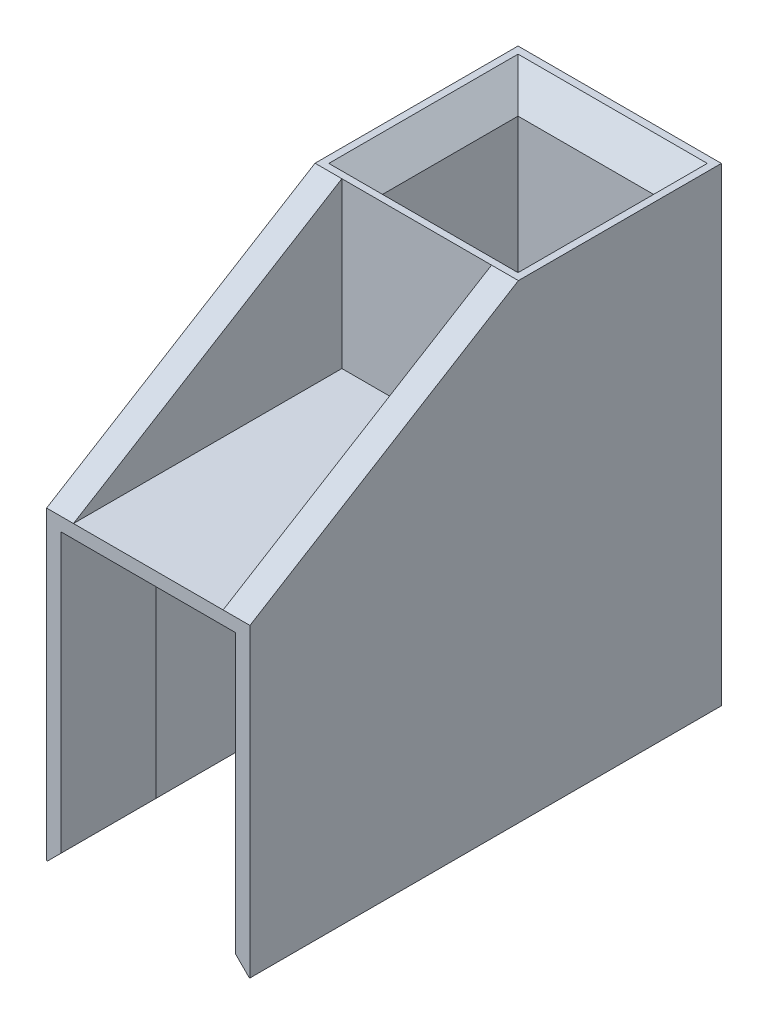
ISO-10303-21;
HEADER;
FILE_DESCRIPTION(('STEP AP214'),'2;1');
FILE_NAME('part.step','',(''),(''),'','','');
FILE_SCHEMA(('AUTOMOTIVE_DESIGN { 1 0 10303 214 1 1 1 1 }'));
ENDSEC;
DATA;
#1=APPLICATION_CONTEXT('core data for automotive mechanical design processes');
#2=APPLICATION_PROTOCOL_DEFINITION('international standard','automotive_design',2000,#1);
#3=PRODUCT_CONTEXT('',#1,'mechanical');
#4=PRODUCT('Part','Part','',(#3));
#5=PRODUCT_RELATED_PRODUCT_CATEGORY('part','',(#4));
#6=PRODUCT_DEFINITION_FORMATION('','',#4);
#7=PRODUCT_DEFINITION_CONTEXT('part definition',#1,'design');
#8=PRODUCT_DEFINITION('design','',#6,#7);
#9=PRODUCT_DEFINITION_SHAPE('','',#8);
#10=(LENGTH_UNIT() NAMED_UNIT(*) SI_UNIT(.MILLI.,.METRE.));
#11=(NAMED_UNIT(*) PLANE_ANGLE_UNIT() SI_UNIT($,.RADIAN.));
#12=(NAMED_UNIT(*) SI_UNIT($,.STERADIAN.) SOLID_ANGLE_UNIT());
#13=UNCERTAINTY_MEASURE_WITH_UNIT(LENGTH_MEASURE(1.E-05),#10,'distance_accuracy_value','');
#14=(GEOMETRIC_REPRESENTATION_CONTEXT(3) GLOBAL_UNCERTAINTY_ASSIGNED_CONTEXT((#13)) GLOBAL_UNIT_ASSIGNED_CONTEXT((#10,
#11,#12)) REPRESENTATION_CONTEXT('',''));
#15=CARTESIAN_POINT('',(0.,0.,0.));
#16=DIRECTION('',(0.,0.,1.));
#17=DIRECTION('',(1.,0.,0.));
#18=AXIS2_PLACEMENT_3D('',#15,#16,#17);
#19=CARTESIAN_POINT('',(62.0568225314826,52.2270196568572,-3.63595046017497));
#20=DIRECTION('',(0.,0.85275441484345,0.522312079091614));
#21=DIRECTION('',(0.,-0.522312079091614,0.852754414843451));
#22=AXIS2_PLACEMENT_3D('',#19,#20,#21);
#23=PLANE('',#22);
#24=DIRECTION('',(-1.,0.,0.));
#25=VECTOR('',#24,1.);
#26=CARTESIAN_POINT('',(0.,25.5,40.));
#27=LINE('',#26,#25);
#28=CARTESIAN_POINT('',(-11.15,25.5,40.));
#29=VERTEX_POINT('',#28);
#30=CARTESIAN_POINT('',(-15.15,25.5,40.));
#31=VERTEX_POINT('',#30);
#32=EDGE_CURVE('E219',#29,#31,#27,.T.);
#33=ORIENTED_EDGE('',*,*,#32,.F.);
#34=DIRECTION('',(0.,0.522312079091614,-0.852754414843451));
#35=VECTOR('',#34,1.);
#36=CARTESIAN_POINT('',(-11.15,52.2270196568572,-3.63595046017497));
#37=LINE('',#36,#35);
#38=CARTESIAN_POINT('',(-11.15,50.,0.));
#39=VERTEX_POINT('',#38);
#40=EDGE_CURVE('E196',#29,#39,#37,.T.);
#41=ORIENTED_EDGE('',*,*,#40,.T.);
#42=DIRECTION('',(-1.,0.,0.));
#43=VECTOR('',#42,1.);
#44=CARTESIAN_POINT('',(-15.15,50.,0.));
#45=LINE('',#44,#43);
#46=CARTESIAN_POINT('',(-15.15,50.,0.));
#47=VERTEX_POINT('',#46);
#48=EDGE_CURVE('E299',#39,#47,#45,.T.);
#49=ORIENTED_EDGE('',*,*,#48,.T.);
#50=DIRECTION('',(0.,0.522312079091614,-0.852754414843451));
#51=VECTOR('',#50,1.);
#52=CARTESIAN_POINT('',(-15.15,52.2270196568572,-3.63595046017497));
#53=LINE('',#52,#51);
#54=EDGE_CURVE('E215',#31,#47,#53,.T.);
#55=ORIENTED_EDGE('',*,*,#54,.F.);
#56=EDGE_LOOP('',(#33,#41,#49,#55));
#57=FACE_BOUND('',#56,.T.);
#58=ADVANCED_FACE('F43',(#57),#23,.T.);
#59=CARTESIAN_POINT('',(15.15,50.,0.));
#60=VERTEX_POINT('',#59);
#61=CARTESIAN_POINT('',(11.15,50.,0.));
#62=VERTEX_POINT('',#61);
#63=EDGE_CURVE('E300',#60,#62,#45,.T.);
#64=ORIENTED_EDGE('',*,*,#63,.T.);
#65=DIRECTION('',(0.,-0.522312079091614,0.852754414843451));
#66=VECTOR('',#65,1.);
#67=CARTESIAN_POINT('',(11.15,52.2270196568572,-3.63595046017497));
#68=LINE('',#67,#66);
#69=CARTESIAN_POINT('',(11.15,25.5,40.));
#70=VERTEX_POINT('',#69);
#71=EDGE_CURVE('E206',#62,#70,#68,.T.);
#72=ORIENTED_EDGE('',*,*,#71,.T.);
#73=CARTESIAN_POINT('',(15.15,25.5,40.));
#74=VERTEX_POINT('',#73);
#75=EDGE_CURVE('E224',#74,#70,#27,.T.);
#76=ORIENTED_EDGE('',*,*,#75,.F.);
#77=DIRECTION('',(0.,0.522312079091614,-0.852754414843451));
#78=VECTOR('',#77,1.);
#79=CARTESIAN_POINT('',(15.15,52.2270196568572,-3.63595046017497));
#80=LINE('',#79,#78);
#81=EDGE_CURVE('E243',#74,#60,#80,.T.);
#82=ORIENTED_EDGE('',*,*,#81,.T.);
#83=EDGE_LOOP('',(#64,#72,#76,#82));
#84=FACE_BOUND('',#83,.T.);
#85=ADVANCED_FACE('F425',(#84),#23,.T.);
#86=CARTESIAN_POINT('',(0.,0.,0.));
#87=DIRECTION('',(0.,0.,1.));
#88=DIRECTION('',(1.,0.,0.));
#89=AXIS2_PLACEMENT_3D('',#86,#87,#88);
#90=PLANE('',#89);
#91=DIRECTION('',(0.,-1.,0.));
#92=VECTOR('',#91,1.);
#93=CARTESIAN_POINT('',(10.025,0.,0.));
#94=LINE('',#93,#92);
#95=CARTESIAN_POINT('',(10.025,20.5,0.));
#96=VERTEX_POINT('',#95);
#97=CARTESIAN_POINT('',(10.025,-15.,0.));
#98=VERTEX_POINT('',#97);
#99=EDGE_CURVE('E246',#96,#98,#94,.T.);
#100=ORIENTED_EDGE('',*,*,#99,.F.);
#101=DIRECTION('',(-1.,0.,0.));
#102=VECTOR('',#101,1.);
#103=CARTESIAN_POINT('',(0.,20.5,0.));
#104=LINE('',#103,#102);
#105=CARTESIAN_POINT('',(-10.025,20.5,0.));
#106=VERTEX_POINT('',#105);
#107=EDGE_CURVE('E257',#96,#106,#104,.T.);
#108=ORIENTED_EDGE('',*,*,#107,.T.);
#109=DIRECTION('',(0.,-1.,0.));
#110=VECTOR('',#109,1.);
#111=CARTESIAN_POINT('',(-10.025,0.,0.));
#112=LINE('',#111,#110);
#113=CARTESIAN_POINT('',(-10.025,-15.,0.));
#114=VERTEX_POINT('',#113);
#115=EDGE_CURVE('E245',#106,#114,#112,.T.);
#116=ORIENTED_EDGE('',*,*,#115,.T.);
#117=DIRECTION('',(0.707106781186548,0.707106781186547,0.));
#118=VECTOR('',#117,1.);
#119=CARTESIAN_POINT('',(-10.025,-15.,0.));
#120=LINE('',#119,#118);
#121=CARTESIAN_POINT('',(-15.025,-20.,0.));
#122=VERTEX_POINT('',#121);
#123=EDGE_CURVE('E11',#114,#122,#120,.F.);
#124=ORIENTED_EDGE('',*,*,#123,.T.);
#125=DIRECTION('',(1.,0.,0.));
#126=VECTOR('',#125,1.);
#127=CARTESIAN_POINT('',(-15.15,-20.,0.));
#128=LINE('',#127,#126);
#129=CARTESIAN_POINT('',(15.025,-20.,0.));
#130=VERTEX_POINT('',#129);
#131=EDGE_CURVE('E303',#122,#130,#128,.T.);
#132=ORIENTED_EDGE('',*,*,#131,.T.);
#133=DIRECTION('',(-0.707106781186546,0.707106781186549,0.));
#134=VECTOR('',#133,1.);
#135=CARTESIAN_POINT('',(15.025,-20.,0.));
#136=LINE('',#135,#134);
#137=EDGE_CURVE('E52',#130,#98,#136,.T.);
#138=ORIENTED_EDGE('',*,*,#137,.T.);
#139=EDGE_LOOP('',(#100,#108,#116,#124,#132,#138));
#140=FACE_BOUND('',#139,.T.);
#141=ADVANCED_FACE('F379',(#140),#90,.T.);
#142=CARTESIAN_POINT('',(0.,0.,-5.));
#143=DIRECTION('',(0.,0.,1.));
#144=DIRECTION('',(1.,0.,0.));
#145=AXIS2_PLACEMENT_3D('',#142,#143,#144);
#146=PLANE('',#145);
#147=DIRECTION('',(0.,-1.,0.));
#148=VECTOR('',#147,1.);
#149=CARTESIAN_POINT('',(-10.1,89.4417608633286,-5.));
#150=LINE('',#149,#148);
#151=CARTESIAN_POINT('',(-10.1,46.,-5.));
#152=VERTEX_POINT('',#151);
#153=CARTESIAN_POINT('',(-10.1,-16.,-5.));
#154=VERTEX_POINT('',#153);
#155=EDGE_CURVE('E293',#152,#154,#150,.T.);
#156=ORIENTED_EDGE('',*,*,#155,.F.);
#157=DIRECTION('',(1.,0.,0.));
#158=VECTOR('',#157,1.);
#159=CARTESIAN_POINT('',(10.1,46.,-5.));
#160=LINE('',#159,#158);
#161=CARTESIAN_POINT('',(10.1,46.,-5.));
#162=VERTEX_POINT('',#161);
#163=EDGE_CURVE('E326',#152,#162,#160,.T.);
#164=ORIENTED_EDGE('',*,*,#163,.T.);
#165=DIRECTION('',(0.,-1.,0.));
#166=VECTOR('',#165,1.);
#167=CARTESIAN_POINT('',(10.1,89.4417608633286,-5.));
#168=LINE('',#167,#166);
#169=CARTESIAN_POINT('',(10.1,-16.,-5.));
#170=VERTEX_POINT('',#169);
#171=EDGE_CURVE('E283',#162,#170,#168,.T.);
#172=ORIENTED_EDGE('',*,*,#171,.T.);
#173=DIRECTION('',(-1.,0.,0.));
#174=VECTOR('',#173,1.);
#175=CARTESIAN_POINT('',(-15.15,-16.,-5.));
#176=LINE('',#175,#174);
#177=EDGE_CURVE('E269',#170,#154,#176,.T.);
#178=ORIENTED_EDGE('',*,*,#177,.T.);
#179=EDGE_LOOP('',(#156,#164,#172,#178));
#180=FACE_BOUND('',#179,.T.);
#181=ADVANCED_FACE('F479',(#180),#146,.F.);
#182=CARTESIAN_POINT('',(10.1,89.4417608633286,-5.));
#183=DIRECTION('',(-1.,0.,0.));
#184=DIRECTION('',(0.,0.,1.));
#185=AXIS2_PLACEMENT_3D('',#182,#183,#184);
#186=PLANE('',#185);
#187=ORIENTED_EDGE('',*,*,#171,.F.);
#188=DIRECTION('',(0.,0.,-1.));
#189=VECTOR('',#188,1.);
#190=CARTESIAN_POINT('',(10.1,46.,-5.));
#191=LINE('',#190,#189);
#192=CARTESIAN_POINT('',(10.1,46.,-25.2));
#193=VERTEX_POINT('',#192);
#194=EDGE_CURVE('E329',#162,#193,#191,.T.);
#195=ORIENTED_EDGE('',*,*,#194,.T.);
#196=DIRECTION('',(0.,-1.,0.));
#197=VECTOR('',#196,1.);
#198=CARTESIAN_POINT('',(10.1,89.4417608633286,-25.2));
#199=LINE('',#198,#197);
#200=CARTESIAN_POINT('',(10.1,-16.,-25.2));
#201=VERTEX_POINT('',#200);
#202=EDGE_CURVE('E287',#193,#201,#199,.T.);
#203=ORIENTED_EDGE('',*,*,#202,.T.);
#204=DIRECTION('',(0.,0.,1.));
#205=VECTOR('',#204,1.);
#206=CARTESIAN_POINT('',(10.1,-16.,-5.));
#207=LINE('',#206,#205);
#208=EDGE_CURVE('E266',#201,#170,#207,.T.);
#209=ORIENTED_EDGE('',*,*,#208,.T.);
#210=EDGE_LOOP('',(#187,#195,#203,#209));
#211=FACE_BOUND('',#210,.T.);
#212=ADVANCED_FACE('F475',(#211),#186,.T.);
#213=CARTESIAN_POINT('',(-15.15,89.4417608633286,-25.2));
#214=DIRECTION('',(0.,0.,1.));
#215=DIRECTION('',(1.,0.,0.));
#216=AXIS2_PLACEMENT_3D('',#213,#214,#215);
#217=PLANE('',#216);
#218=ORIENTED_EDGE('',*,*,#202,.F.);
#219=DIRECTION('',(-1.,0.,0.));
#220=VECTOR('',#219,1.);
#221=CARTESIAN_POINT('',(-15.15,46.,-25.2));
#222=LINE('',#221,#220);
#223=CARTESIAN_POINT('',(-10.1,46.,-25.2));
#224=VERTEX_POINT('',#223);
#225=EDGE_CURVE('E331',#193,#224,#222,.T.);
#226=ORIENTED_EDGE('',*,*,#225,.T.);
#227=DIRECTION('',(0.,-1.,0.));
#228=VECTOR('',#227,1.);
#229=CARTESIAN_POINT('',(-10.1,89.4417608633286,-25.2));
#230=LINE('',#229,#228);
#231=CARTESIAN_POINT('',(-10.1,-16.,-25.2));
#232=VERTEX_POINT('',#231);
#233=EDGE_CURVE('E295',#224,#232,#230,.T.);
#234=ORIENTED_EDGE('',*,*,#233,.T.);
#235=DIRECTION('',(1.,0.,0.));
#236=VECTOR('',#235,1.);
#237=CARTESIAN_POINT('',(-15.15,-16.,-25.2));
#238=LINE('',#237,#236);
#239=EDGE_CURVE('E276',#232,#201,#238,.T.);
#240=ORIENTED_EDGE('',*,*,#239,.T.);
#241=EDGE_LOOP('',(#218,#226,#234,#240));
#242=FACE_BOUND('',#241,.T.);
#243=ADVANCED_FACE('F471',(#242),#217,.T.);
#244=CARTESIAN_POINT('',(-10.1,89.4417608633286,-5.));
#245=DIRECTION('',(1.,0.,0.));
#246=DIRECTION('',(0.,0.,-1.));
#247=AXIS2_PLACEMENT_3D('',#244,#245,#246);
#248=PLANE('',#247);
#249=ORIENTED_EDGE('',*,*,#233,.F.);
#250=DIRECTION('',(0.,0.,1.));
#251=VECTOR('',#250,1.);
#252=CARTESIAN_POINT('',(-10.1,46.,-5.));
#253=LINE('',#252,#251);
#254=EDGE_CURVE('E333',#224,#152,#253,.T.);
#255=ORIENTED_EDGE('',*,*,#254,.T.);
#256=ORIENTED_EDGE('',*,*,#155,.T.);
#257=DIRECTION('',(0.,0.,-1.));
#258=VECTOR('',#257,1.);
#259=CARTESIAN_POINT('',(-10.1,-16.,-5.));
#260=LINE('',#259,#258);
#261=EDGE_CURVE('E273',#154,#232,#260,.T.);
#262=ORIENTED_EDGE('',*,*,#261,.T.);
#263=EDGE_LOOP('',(#249,#255,#256,#262));
#264=FACE_BOUND('',#263,.T.);
#265=ADVANCED_FACE('F468',(#264),#248,.T.);
#266=CARTESIAN_POINT('',(15.15,50.,-5.));
#267=DIRECTION('',(1.,0.,0.));
#268=DIRECTION('',(0.,1.,0.));
#269=AXIS2_PLACEMENT_3D('',#266,#267,#268);
#270=PLANE('',#269);
#271=DIRECTION('',(0.,0.,1.));
#272=VECTOR('',#271,1.);
#273=CARTESIAN_POINT('',(15.15,50.,-5.));
#274=LINE('',#273,#272);
#275=CARTESIAN_POINT('',(15.15,50.,-30.25));
#276=VERTEX_POINT('',#275);
#277=EDGE_CURVE('E305',#276,#60,#274,.T.);
#278=ORIENTED_EDGE('',*,*,#277,.T.);
#279=ORIENTED_EDGE('',*,*,#81,.F.);
#280=DIRECTION('',(0.,1.,0.));
#281=VECTOR('',#280,1.);
#282=CARTESIAN_POINT('',(15.15,0.,40.));
#283=LINE('',#282,#281);
#284=CARTESIAN_POINT('',(15.15,-20.,40.));
#285=VERTEX_POINT('',#284);
#286=EDGE_CURVE('E225',#285,#74,#283,.T.);
#287=ORIENTED_EDGE('',*,*,#286,.F.);
#288=DIRECTION('',(0.,0.,1.));
#289=VECTOR('',#288,1.);
#290=CARTESIAN_POINT('',(15.15,-20.,-5.));
#291=LINE('',#290,#289);
#292=CARTESIAN_POINT('',(15.15,-20.,-30.25));
#293=VERTEX_POINT('',#292);
#294=EDGE_CURVE('E306',#293,#285,#291,.T.);
#295=ORIENTED_EDGE('',*,*,#294,.F.);
#296=DIRECTION('',(0.,-1.,0.));
#297=VECTOR('',#296,1.);
#298=CARTESIAN_POINT('',(15.15,89.4417608633286,-30.25));
#299=LINE('',#298,#297);
#300=EDGE_CURVE('E284',#276,#293,#299,.T.);
#301=ORIENTED_EDGE('',*,*,#300,.F.);
#302=EDGE_LOOP('',(#278,#279,#287,#295,#301));
#303=FACE_BOUND('',#302,.T.);
#304=ADVANCED_FACE('F422',(#303),#270,.T.);
#305=CARTESIAN_POINT('',(-15.15,-20.,-5.));
#306=DIRECTION('',(0.,-1.,0.));
#307=DIRECTION('',(1.,0.,0.));
#308=AXIS2_PLACEMENT_3D('',#305,#306,#307);
#309=PLANE('',#308);
#310=DIRECTION('',(1.,0.,0.));
#311=VECTOR('',#310,1.);
#312=CARTESIAN_POINT('',(0.,-20.,40.));
#313=LINE('',#312,#311);
#314=CARTESIAN_POINT('',(15.025,-20.,40.));
#315=VERTEX_POINT('',#314);
#316=EDGE_CURVE('E252',#315,#285,#313,.T.);
#317=ORIENTED_EDGE('',*,*,#316,.F.);
#318=DIRECTION('',(0.,0.,-1.));
#319=VECTOR('',#318,1.);
#320=CARTESIAN_POINT('',(15.025,-20.,0.));
#321=LINE('',#320,#319);
#322=EDGE_CURVE('E363',#315,#130,#321,.T.);
#323=ORIENTED_EDGE('',*,*,#322,.T.);
#324=ORIENTED_EDGE('',*,*,#131,.F.);
#325=DIRECTION('',(0.,0.,1.));
#326=VECTOR('',#325,1.);
#327=CARTESIAN_POINT('',(-15.025,-20.,-5.));
#328=LINE('',#327,#326);
#329=CARTESIAN_POINT('',(-15.025,-20.,40.));
#330=VERTEX_POINT('',#329);
#331=EDGE_CURVE('E356',#122,#330,#328,.T.);
#332=ORIENTED_EDGE('',*,*,#331,.T.);
#333=DIRECTION('',(-1.,0.,0.));
#334=VECTOR('',#333,1.);
#335=CARTESIAN_POINT('',(0.,-20.,40.));
#336=LINE('',#335,#334);
#337=CARTESIAN_POINT('',(-15.15,-20.,40.));
#338=VERTEX_POINT('',#337);
#339=EDGE_CURVE('E250',#330,#338,#336,.T.);
#340=ORIENTED_EDGE('',*,*,#339,.T.);
#341=DIRECTION('',(0.,0.,1.));
#342=VECTOR('',#341,1.);
#343=CARTESIAN_POINT('',(-15.15,-20.,-5.));
#344=LINE('',#343,#342);
#345=CARTESIAN_POINT('',(-15.15,-20.,-30.25));
#346=VERTEX_POINT('',#345);
#347=EDGE_CURVE('E310',#346,#338,#344,.T.);
#348=ORIENTED_EDGE('',*,*,#347,.F.);
#349=DIRECTION('',(-1.,0.,0.));
#350=VECTOR('',#349,1.);
#351=CARTESIAN_POINT('',(-15.15,-20.,-30.25));
#352=LINE('',#351,#350);
#353=EDGE_CURVE('E280',#293,#346,#352,.T.);
#354=ORIENTED_EDGE('',*,*,#353,.F.);
#355=ORIENTED_EDGE('',*,*,#294,.T.);
#356=EDGE_LOOP('',(#317,#323,#324,#332,#340,#348,#354,#355));
#357=FACE_BOUND('',#356,.T.);
#358=ADVANCED_FACE('F411',(#357),#309,.T.);
#359=CARTESIAN_POINT('',(-15.15,50.,-5.));
#360=DIRECTION('',(-1.,0.,0.));
#361=DIRECTION('',(0.,-1.,0.));
#362=AXIS2_PLACEMENT_3D('',#359,#360,#361);
#363=PLANE('',#362);
#364=ORIENTED_EDGE('',*,*,#54,.T.);
#365=DIRECTION('',(0.,0.,1.));
#366=VECTOR('',#365,1.);
#367=CARTESIAN_POINT('',(-15.15,50.,-5.));
#368=LINE('',#367,#366);
#369=CARTESIAN_POINT('',(-15.15,50.,-30.25));
#370=VERTEX_POINT('',#369);
#371=EDGE_CURVE('E313',#370,#47,#368,.T.);
#372=ORIENTED_EDGE('',*,*,#371,.F.);
#373=DIRECTION('',(0.,-1.,0.));
#374=VECTOR('',#373,1.);
#375=CARTESIAN_POINT('',(-15.15,89.4417608633286,-30.25));
#376=LINE('',#375,#374);
#377=EDGE_CURVE('E290',#370,#346,#376,.T.);
#378=ORIENTED_EDGE('',*,*,#377,.T.);
#379=ORIENTED_EDGE('',*,*,#347,.T.);
#380=DIRECTION('',(0.,1.,0.));
#381=VECTOR('',#380,1.);
#382=CARTESIAN_POINT('',(-15.15,0.,40.));
#383=LINE('',#382,#381);
#384=EDGE_CURVE('E248',#338,#31,#383,.T.);
#385=ORIENTED_EDGE('',*,*,#384,.T.);
#386=EDGE_LOOP('',(#364,#372,#378,#379,#385));
#387=FACE_BOUND('',#386,.T.);
#388=ADVANCED_FACE('F413',(#387),#363,.T.);
#389=CARTESIAN_POINT('',(-15.15,50.,-5.));
#390=DIRECTION('',(0.,1.,0.));
#391=DIRECTION('',(-1.,0.,0.));
#392=AXIS2_PLACEMENT_3D('',#389,#390,#391);
#393=PLANE('',#392);
#394=DIRECTION('',(0.,0.,1.));
#395=VECTOR('',#394,1.);
#396=CARTESIAN_POINT('',(14.1,50.,-5.));
#397=LINE('',#396,#395);
#398=CARTESIAN_POINT('',(14.1,50.,-29.2));
#399=VERTEX_POINT('',#398);
#400=CARTESIAN_POINT('',(14.1,50.,-0.999999999999977));
#401=VERTEX_POINT('',#400);
#402=EDGE_CURVE('E321',#399,#401,#397,.T.);
#403=ORIENTED_EDGE('',*,*,#402,.T.);
#404=DIRECTION('',(-1.,0.,0.));
#405=VECTOR('',#404,1.);
#406=CARTESIAN_POINT('',(-10.1,50.,-0.999999999999977));
#407=LINE('',#406,#405);
#408=CARTESIAN_POINT('',(-14.1,50.,-0.999999999999977));
#409=VERTEX_POINT('',#408);
#410=EDGE_CURVE('E323',#401,#409,#407,.T.);
#411=ORIENTED_EDGE('',*,*,#410,.T.);
#412=DIRECTION('',(0.,0.,-1.));
#413=VECTOR('',#412,1.);
#414=CARTESIAN_POINT('',(-14.1,50.,-5.));
#415=LINE('',#414,#413);
#416=CARTESIAN_POINT('',(-14.1,50.,-29.2));
#417=VERTEX_POINT('',#416);
#418=EDGE_CURVE('E309',#409,#417,#415,.T.);
#419=ORIENTED_EDGE('',*,*,#418,.T.);
#420=DIRECTION('',(1.,0.,0.));
#421=VECTOR('',#420,1.);
#422=CARTESIAN_POINT('',(-15.15,50.,-29.2));
#423=LINE('',#422,#421);
#424=EDGE_CURVE('E319',#417,#399,#423,.T.);
#425=ORIENTED_EDGE('',*,*,#424,.T.);
#426=EDGE_LOOP('',(#403,#411,#419,#425));
#427=FACE_BOUND('',#426,.T.);
#428=ORIENTED_EDGE('',*,*,#63,.F.);
#429=ORIENTED_EDGE('',*,*,#277,.F.);
#430=DIRECTION('',(-1.,0.,0.));
#431=VECTOR('',#430,1.);
#432=CARTESIAN_POINT('',(-15.15,50.,-30.25));
#433=LINE('',#432,#431);
#434=EDGE_CURVE('E279',#276,#370,#433,.T.);
#435=ORIENTED_EDGE('',*,*,#434,.T.);
#436=ORIENTED_EDGE('',*,*,#371,.T.);
#437=ORIENTED_EDGE('',*,*,#48,.F.);
#438=DIRECTION('',(-1.,0.,0.));
#439=VECTOR('',#438,1.);
#440=CARTESIAN_POINT('',(-11.15,50.,0.));
#441=LINE('',#440,#439);
#442=EDGE_CURVE('E232',#62,#39,#441,.T.);
#443=ORIENTED_EDGE('',*,*,#442,.F.);
#444=EDGE_LOOP('',(#428,#429,#435,#436,#437,#443));
#445=FACE_BOUND('',#444,.T.);
#446=ADVANCED_FACE('F432',(#427,#445),#393,.T.);
#447=CARTESIAN_POINT('',(-15.15,89.4417608633286,-30.25));
#448=DIRECTION('',(0.,0.,1.));
#449=DIRECTION('',(1.,0.,0.));
#450=AXIS2_PLACEMENT_3D('',#447,#448,#449);
#451=PLANE('',#450);
#452=ORIENTED_EDGE('',*,*,#434,.F.);
#453=ORIENTED_EDGE('',*,*,#300,.T.);
#454=ORIENTED_EDGE('',*,*,#353,.T.);
#455=ORIENTED_EDGE('',*,*,#377,.F.);
#456=EDGE_LOOP('',(#452,#453,#454,#455));
#457=FACE_BOUND('',#456,.T.);
#458=ADVANCED_FACE('F419',(#457),#451,.F.);
#459=CARTESIAN_POINT('',(0.,-16.,0.));
#460=DIRECTION('',(0.,-1.,0.));
#461=DIRECTION('',(1.,0.,0.));
#462=AXIS2_PLACEMENT_3D('',#459,#460,#461);
#463=PLANE('',#462);
#464=ORIENTED_EDGE('',*,*,#208,.F.);
#465=ORIENTED_EDGE('',*,*,#239,.F.);
#466=ORIENTED_EDGE('',*,*,#261,.F.);
#467=ORIENTED_EDGE('',*,*,#177,.F.);
#468=EDGE_LOOP('',(#464,#465,#466,#467));
#469=FACE_BOUND('',#468,.T.);
#470=ADVANCED_FACE('F461',(#469),#463,.F.);
#471=CARTESIAN_POINT('',(-15.15,46.,-25.2));
#472=DIRECTION('',(0.,-0.707106781186549,-0.707106781186546));
#473=DIRECTION('',(-1.,0.,0.));
#474=AXIS2_PLACEMENT_3D('',#471,#472,#473);
#475=PLANE('',#474);
#476=DIRECTION('',(-0.577350269189626,0.577350269189624,-0.577350269189627));
#477=VECTOR('',#476,1.);
#478=CARTESIAN_POINT('',(-11.7833333333333,47.6833333333333,-26.8833333333333));
#479=LINE('',#478,#477);
#480=EDGE_CURVE('E338',#224,#417,#479,.T.);
#481=ORIENTED_EDGE('',*,*,#480,.F.);
#482=ORIENTED_EDGE('',*,*,#225,.F.);
#483=DIRECTION('',(0.577350269189626,0.577350269189625,-0.577350269189627));
#484=VECTOR('',#483,1.);
#485=CARTESIAN_POINT('',(3.36666666666665,39.2666666666667,-18.4666666666667));
#486=LINE('',#485,#484);
#487=EDGE_CURVE('E270',#399,#193,#486,.F.);
#488=ORIENTED_EDGE('',*,*,#487,.F.);
#489=ORIENTED_EDGE('',*,*,#424,.F.);
#490=EDGE_LOOP('',(#481,#482,#488,#489));
#491=FACE_BOUND('',#490,.T.);
#492=ADVANCED_FACE('F464',(#491),#475,.F.);
#493=CARTESIAN_POINT('',(10.1,46.,-5.));
#494=DIRECTION('',(0.707106781186547,-0.707106781186548,0.));
#495=DIRECTION('',(0.,0.,-1.));
#496=AXIS2_PLACEMENT_3D('',#493,#494,#495);
#497=PLANE('',#496);
#498=ORIENTED_EDGE('',*,*,#487,.T.);
#499=ORIENTED_EDGE('',*,*,#194,.F.);
#500=DIRECTION('',(-0.577350269189626,-0.577350269189625,-0.577350269189626));
#501=VECTOR('',#500,1.);
#502=CARTESIAN_POINT('',(4.34999999999999,40.25,-10.75));
#503=LINE('',#502,#501);
#504=EDGE_CURVE('E336',#401,#162,#503,.T.);
#505=ORIENTED_EDGE('',*,*,#504,.F.);
#506=ORIENTED_EDGE('',*,*,#402,.F.);
#507=EDGE_LOOP('',(#498,#499,#505,#506));
#508=FACE_BOUND('',#507,.T.);
#509=ADVANCED_FACE('F508',(#508),#497,.F.);
#510=CARTESIAN_POINT('',(-10.1,46.,-5.));
#511=DIRECTION('',(-0.707106781186546,-0.707106781186549,0.));
#512=DIRECTION('',(0.,0.,1.));
#513=AXIS2_PLACEMENT_3D('',#510,#511,#512);
#514=PLANE('',#513);
#515=ORIENTED_EDGE('',*,*,#480,.T.);
#516=ORIENTED_EDGE('',*,*,#418,.F.);
#517=DIRECTION('',(-0.577350269189626,0.577350269189624,0.577350269189626));
#518=VECTOR('',#517,1.);
#519=CARTESIAN_POINT('',(-14.45,50.35,-0.649999999999985));
#520=LINE('',#519,#518);
#521=EDGE_CURVE('E265',#152,#409,#520,.T.);
#522=ORIENTED_EDGE('',*,*,#521,.F.);
#523=ORIENTED_EDGE('',*,*,#254,.F.);
#524=EDGE_LOOP('',(#515,#516,#522,#523));
#525=FACE_BOUND('',#524,.T.);
#526=ADVANCED_FACE('F501',(#525),#514,.F.);
#527=CARTESIAN_POINT('',(-15.15,50.,-0.999999999999977));
#528=DIRECTION('',(0.,0.707106781186549,-0.707106781186546));
#529=DIRECTION('',(1.,0.,0.));
#530=AXIS2_PLACEMENT_3D('',#527,#528,#529);
#531=PLANE('',#530);
#532=ORIENTED_EDGE('',*,*,#504,.T.);
#533=ORIENTED_EDGE('',*,*,#163,.F.);
#534=ORIENTED_EDGE('',*,*,#521,.T.);
#535=ORIENTED_EDGE('',*,*,#410,.F.);
#536=EDGE_LOOP('',(#532,#533,#534,#535));
#537=FACE_BOUND('',#536,.T.);
#538=ADVANCED_FACE('F460',(#537),#531,.T.);
#539=CARTESIAN_POINT('',(-10.025,0.,40.));
#540=DIRECTION('',(1.,0.,0.));
#541=DIRECTION('',(0.,0.,-1.));
#542=AXIS2_PLACEMENT_3D('',#539,#540,#541);
#543=PLANE('',#542);
#544=DIRECTION('',(0.,-1.,0.));
#545=VECTOR('',#544,1.);
#546=CARTESIAN_POINT('',(-10.025,0.,28.8038475772934));
#547=LINE('',#546,#545);
#548=CARTESIAN_POINT('',(-10.025,20.5,28.8038475772934));
#549=VERTEX_POINT('',#548);
#550=CARTESIAN_POINT('',(-10.025,-15.,28.8038475772934));
#551=VERTEX_POINT('',#550);
#552=EDGE_CURVE('E354',#549,#551,#547,.T.);
#553=ORIENTED_EDGE('',*,*,#552,.T.);
#554=DIRECTION('',(0.,0.,-1.));
#555=VECTOR('',#554,1.);
#556=CARTESIAN_POINT('',(-10.025,-15.,40.));
#557=LINE('',#556,#555);
#558=EDGE_CURVE('E374',#551,#114,#557,.T.);
#559=ORIENTED_EDGE('',*,*,#558,.T.);
#560=ORIENTED_EDGE('',*,*,#115,.F.);
#561=DIRECTION('',(0.,0.,-1.));
#562=VECTOR('',#561,1.);
#563=CARTESIAN_POINT('',(-10.025,20.5,40.));
#564=LINE('',#563,#562);
#565=EDGE_CURVE('E263',#549,#106,#564,.T.);
#566=ORIENTED_EDGE('',*,*,#565,.F.);
#567=EDGE_LOOP('',(#553,#559,#560,#566));
#568=FACE_BOUND('',#567,.T.);
#569=ADVANCED_FACE('F406',(#568),#543,.T.);
#570=CARTESIAN_POINT('',(0.,20.5,40.));
#571=DIRECTION('',(0.,-1.,0.));
#572=DIRECTION('',(0.,0.,-1.));
#573=AXIS2_PLACEMENT_3D('',#570,#571,#572);
#574=PLANE('',#573);
#575=DIRECTION('',(0.,0.,-1.));
#576=VECTOR('',#575,1.);
#577=CARTESIAN_POINT('',(10.025,20.5,40.));
#578=LINE('',#577,#576);
#579=CARTESIAN_POINT('',(10.025,20.5,28.8038475772934));
#580=VERTEX_POINT('',#579);
#581=EDGE_CURVE('E254',#580,#96,#578,.T.);
#582=ORIENTED_EDGE('',*,*,#581,.F.);
#583=DIRECTION('',(-1.,0.,0.));
#584=VECTOR('',#583,1.);
#585=CARTESIAN_POINT('',(0.,20.5,28.8038475772934));
#586=LINE('',#585,#584);
#587=EDGE_CURVE('E352',#580,#549,#586,.T.);
#588=ORIENTED_EDGE('',*,*,#587,.T.);
#589=ORIENTED_EDGE('',*,*,#565,.T.);
#590=ORIENTED_EDGE('',*,*,#107,.F.);
#591=EDGE_LOOP('',(#582,#588,#589,#590));
#592=FACE_BOUND('',#591,.T.);
#593=ADVANCED_FACE('F403',(#592),#574,.T.);
#594=CARTESIAN_POINT('',(10.025,0.,40.));
#595=DIRECTION('',(1.,0.,0.));
#596=DIRECTION('',(0.,0.,-1.));
#597=AXIS2_PLACEMENT_3D('',#594,#595,#596);
#598=PLANE('',#597);
#599=ORIENTED_EDGE('',*,*,#99,.T.);
#600=DIRECTION('',(0.,0.,1.));
#601=VECTOR('',#600,1.);
#602=CARTESIAN_POINT('',(10.025,-15.,28.8038475772934));
#603=LINE('',#602,#601);
#604=CARTESIAN_POINT('',(10.025,-15.,28.8038475772934));
#605=VERTEX_POINT('',#604);
#606=EDGE_CURVE('E366',#98,#605,#603,.T.);
#607=ORIENTED_EDGE('',*,*,#606,.T.);
#608=DIRECTION('',(0.,1.,0.));
#609=VECTOR('',#608,1.);
#610=CARTESIAN_POINT('',(10.025,20.5,28.8038475772934));
#611=LINE('',#610,#609);
#612=EDGE_CURVE('E350',#605,#580,#611,.T.);
#613=ORIENTED_EDGE('',*,*,#612,.T.);
#614=ORIENTED_EDGE('',*,*,#581,.T.);
#615=EDGE_LOOP('',(#599,#607,#613,#614));
#616=FACE_BOUND('',#615,.T.);
#617=ADVANCED_FACE('F385',(#616),#598,.F.);
#618=CARTESIAN_POINT('',(0.,0.,40.));
#619=DIRECTION('',(0.,0.,1.));
#620=DIRECTION('',(1.,0.,0.));
#621=AXIS2_PLACEMENT_3D('',#618,#619,#620);
#622=PLANE('',#621);
#623=DIRECTION('',(0.,-1.,0.));
#624=VECTOR('',#623,1.);
#625=CARTESIAN_POINT('',(13.025,-20.,40.));
#626=LINE('',#625,#624);
#627=CARTESIAN_POINT('',(13.025,23.5,40.));
#628=VERTEX_POINT('',#627);
#629=CARTESIAN_POINT('',(13.025,-18.,40.));
#630=VERTEX_POINT('',#629);
#631=EDGE_CURVE('E348',#628,#630,#626,.T.);
#632=ORIENTED_EDGE('',*,*,#631,.T.);
#633=DIRECTION('',(0.707106781186546,-0.707106781186549,0.));
#634=VECTOR('',#633,1.);
#635=CARTESIAN_POINT('',(-2.48749999999997,-2.48749999999995,40.));
#636=LINE('',#635,#634);
#637=EDGE_CURVE('E372',#630,#315,#636,.T.);
#638=ORIENTED_EDGE('',*,*,#637,.T.);
#639=ORIENTED_EDGE('',*,*,#316,.T.);
#640=ORIENTED_EDGE('',*,*,#286,.T.);
#641=ORIENTED_EDGE('',*,*,#75,.T.);
#642=DIRECTION('',(1.,0.,0.));
#643=VECTOR('',#642,1.);
#644=CARTESIAN_POINT('',(-11.15,25.5,40.));
#645=LINE('',#644,#643);
#646=EDGE_CURVE('E212',#29,#70,#645,.T.);
#647=ORIENTED_EDGE('',*,*,#646,.F.);
#648=ORIENTED_EDGE('',*,*,#32,.T.);
#649=ORIENTED_EDGE('',*,*,#384,.F.);
#650=ORIENTED_EDGE('',*,*,#339,.F.);
#651=DIRECTION('',(-0.707106781186548,-0.707106781186547,0.));
#652=VECTOR('',#651,1.);
#653=CARTESIAN_POINT('',(2.48750000000001,-2.48750000000001,40.));
#654=LINE('',#653,#652);
#655=CARTESIAN_POINT('',(-13.025,-18.,40.));
#656=VERTEX_POINT('',#655);
#657=EDGE_CURVE('E370',#330,#656,#654,.F.);
#658=ORIENTED_EDGE('',*,*,#657,.T.);
#659=DIRECTION('',(0.,1.,0.));
#660=VECTOR('',#659,1.);
#661=CARTESIAN_POINT('',(-13.025,0.,40.));
#662=LINE('',#661,#660);
#663=CARTESIAN_POINT('',(-13.025,23.5,40.));
#664=VERTEX_POINT('',#663);
#665=EDGE_CURVE('E205',#656,#664,#662,.T.);
#666=ORIENTED_EDGE('',*,*,#665,.T.);
#667=DIRECTION('',(1.,0.,0.));
#668=VECTOR('',#667,1.);
#669=CARTESIAN_POINT('',(0.,23.5,40.));
#670=LINE('',#669,#668);
#671=EDGE_CURVE('E346',#664,#628,#670,.T.);
#672=ORIENTED_EDGE('',*,*,#671,.T.);
#673=EDGE_LOOP('',(#632,#638,#639,#640,#641,#647,#648,#649,#650,#658,#666,#672));
#674=FACE_BOUND('',#673,.T.);
#675=ADVANCED_FACE('F229',(#674),#622,.T.);
#676=CARTESIAN_POINT('',(-11.15,50.,40.));
#677=DIRECTION('',(1.,0.,0.));
#678=DIRECTION('',(0.,1.,0.));
#679=AXIS2_PLACEMENT_3D('',#676,#677,#678);
#680=PLANE('',#679);
#681=DIRECTION('',(0.,0.,-1.));
#682=VECTOR('',#681,1.);
#683=CARTESIAN_POINT('',(-11.15,25.5,40.));
#684=LINE('',#683,#682);
#685=CARTESIAN_POINT('',(-11.15,25.5,0.));
#686=VERTEX_POINT('',#685);
#687=EDGE_CURVE('E199',#29,#686,#684,.T.);
#688=ORIENTED_EDGE('',*,*,#687,.T.);
#689=DIRECTION('',(0.,-1.,0.));
#690=VECTOR('',#689,1.);
#691=CARTESIAN_POINT('',(-11.15,50.,0.));
#692=LINE('',#691,#690);
#693=EDGE_CURVE('E201',#39,#686,#692,.T.);
#694=ORIENTED_EDGE('',*,*,#693,.F.);
#695=ORIENTED_EDGE('',*,*,#40,.F.);
#696=EDGE_LOOP('',(#688,#694,#695));
#697=FACE_BOUND('',#696,.T.);
#698=ADVANCED_FACE('F198',(#697),#680,.T.);
#699=CARTESIAN_POINT('',(-11.15,25.5,40.));
#700=DIRECTION('',(0.,1.,0.));
#701=DIRECTION('',(0.,0.,1.));
#702=AXIS2_PLACEMENT_3D('',#699,#700,#701);
#703=PLANE('',#702);
#704=DIRECTION('',(1.,0.,0.));
#705=VECTOR('',#704,1.);
#706=CARTESIAN_POINT('',(-11.15,25.5,0.));
#707=LINE('',#706,#705);
#708=CARTESIAN_POINT('',(11.15,25.5,0.));
#709=VERTEX_POINT('',#708);
#710=EDGE_CURVE('E214',#686,#709,#707,.T.);
#711=ORIENTED_EDGE('',*,*,#710,.F.);
#712=ORIENTED_EDGE('',*,*,#687,.F.);
#713=ORIENTED_EDGE('',*,*,#646,.T.);
#714=DIRECTION('',(0.,0.,-1.));
#715=VECTOR('',#714,1.);
#716=CARTESIAN_POINT('',(11.15,25.5,40.));
#717=LINE('',#716,#715);
#718=EDGE_CURVE('E216',#70,#709,#717,.T.);
#719=ORIENTED_EDGE('',*,*,#718,.T.);
#720=EDGE_LOOP('',(#711,#712,#713,#719));
#721=FACE_BOUND('',#720,.T.);
#722=ADVANCED_FACE('F209',(#721),#703,.T.);
#723=CARTESIAN_POINT('',(11.15,50.,40.));
#724=DIRECTION('',(-1.,0.,0.));
#725=DIRECTION('',(0.,-1.,0.));
#726=AXIS2_PLACEMENT_3D('',#723,#724,#725);
#727=PLANE('',#726);
#728=DIRECTION('',(0.,1.,0.));
#729=VECTOR('',#728,1.);
#730=CARTESIAN_POINT('',(11.15,50.,0.));
#731=LINE('',#730,#729);
#732=EDGE_CURVE('E235',#709,#62,#731,.T.);
#733=ORIENTED_EDGE('',*,*,#732,.F.);
#734=ORIENTED_EDGE('',*,*,#718,.F.);
#735=ORIENTED_EDGE('',*,*,#71,.F.);
#736=EDGE_LOOP('',(#733,#734,#735));
#737=FACE_BOUND('',#736,.T.);
#738=ADVANCED_FACE('F430',(#737),#727,.T.);
#739=CARTESIAN_POINT('',(0.,0.,0.));
#740=DIRECTION('',(0.,0.,1.));
#741=DIRECTION('',(1.,0.,0.));
#742=AXIS2_PLACEMENT_3D('',#739,#740,#741);
#743=PLANE('',#742);
#744=ORIENTED_EDGE('',*,*,#693,.T.);
#745=ORIENTED_EDGE('',*,*,#710,.T.);
#746=ORIENTED_EDGE('',*,*,#732,.T.);
#747=ORIENTED_EDGE('',*,*,#442,.T.);
#748=EDGE_LOOP('',(#744,#745,#746,#747));
#749=FACE_BOUND('',#748,.T.);
#750=ADVANCED_FACE('F434',(#749),#743,.T.);
#751=CARTESIAN_POINT('',(-10.025,0.,28.8038475772934));
#752=DIRECTION('',(-0.965925826289068,0.,-0.258819045102522));
#753=DIRECTION('',(0.,-1.,0.));
#754=AXIS2_PLACEMENT_3D('',#751,#752,#753);
#755=PLANE('',#754);
#756=ORIENTED_EDGE('',*,*,#665,.F.);
#757=DIRECTION('',(0.250562807085733,0.250562807085732,-0.935113126531029));
#758=VECTOR('',#757,1.);
#759=CARTESIAN_POINT('',(-9.08327419557977,-14.0582741955798,25.2892790283985));
#760=LINE('',#759,#758);
#761=EDGE_CURVE('E65',#656,#551,#760,.T.);
#762=ORIENTED_EDGE('',*,*,#761,.T.);
#763=ORIENTED_EDGE('',*,*,#552,.F.);
#764=DIRECTION('',(-0.250562807085733,0.250562807085733,0.935113126531029));
#765=VECTOR('',#764,1.);
#766=CARTESIAN_POINT('',(-9.39561325404581,19.8706132540458,26.4549442637819));
#767=LINE('',#766,#765);
#768=EDGE_CURVE('E239',#664,#549,#767,.F.);
#769=ORIENTED_EDGE('',*,*,#768,.F.);
#770=EDGE_LOOP('',(#756,#762,#763,#769));
#771=FACE_BOUND('',#770,.T.);
#772=ADVANCED_FACE('F407',(#771),#755,.F.);
#773=CARTESIAN_POINT('',(0.,20.5,28.8038475772934));
#774=DIRECTION('',(0.,0.965925826289068,-0.258819045102522));
#775=DIRECTION('',(-1.,0.,0.));
#776=AXIS2_PLACEMENT_3D('',#773,#774,#775);
#777=PLANE('',#776);
#778=ORIENTED_EDGE('',*,*,#768,.T.);
#779=ORIENTED_EDGE('',*,*,#587,.F.);
#780=DIRECTION('',(-0.250562807085733,-0.250562807085733,-0.935113126531029));
#781=VECTOR('',#780,1.);
#782=CARTESIAN_POINT('',(11.549629573075,22.024629573075,34.4938426067312));
#783=LINE('',#782,#781);
#784=EDGE_CURVE('E357',#628,#580,#783,.T.);
#785=ORIENTED_EDGE('',*,*,#784,.F.);
#786=ORIENTED_EDGE('',*,*,#671,.F.);
#787=EDGE_LOOP('',(#778,#779,#785,#786));
#788=FACE_BOUND('',#787,.T.);
#789=ADVANCED_FACE('F400',(#788),#777,.F.);
#790=CARTESIAN_POINT('',(13.025,0.,40.));
#791=DIRECTION('',(-0.965925826289068,0.,0.258819045102522));
#792=DIRECTION('',(0.,1.,0.));
#793=AXIS2_PLACEMENT_3D('',#790,#791,#792);
#794=PLANE('',#793);
#795=ORIENTED_EDGE('',*,*,#612,.F.);
#796=DIRECTION('',(0.250562807085733,-0.250562807085734,0.935113126531029));
#797=VECTOR('',#796,1.);
#798=CARTESIAN_POINT('',(11.8949290346957,-16.8699290346957,35.782517741326));
#799=LINE('',#798,#797);
#800=EDGE_CURVE('E368',#605,#630,#799,.T.);
#801=ORIENTED_EDGE('',*,*,#800,.T.);
#802=ORIENTED_EDGE('',*,*,#631,.F.);
#803=ORIENTED_EDGE('',*,*,#784,.T.);
#804=EDGE_LOOP('',(#795,#801,#802,#803));
#805=FACE_BOUND('',#804,.T.);
#806=ADVANCED_FACE('F393',(#805),#794,.T.);
#807=CARTESIAN_POINT('',(15.025,-20.,-5.));
#808=DIRECTION('',(-0.707106781186549,-0.707106781186546,0.));
#809=DIRECTION('',(0.,0.,1.));
#810=AXIS2_PLACEMENT_3D('',#807,#808,#809);
#811=PLANE('',#810);
#812=ORIENTED_EDGE('',*,*,#800,.F.);
#813=ORIENTED_EDGE('',*,*,#606,.F.);
#814=ORIENTED_EDGE('',*,*,#137,.F.);
#815=ORIENTED_EDGE('',*,*,#322,.F.);
#816=ORIENTED_EDGE('',*,*,#637,.F.);
#817=EDGE_LOOP('',(#812,#813,#814,#815,#816));
#818=FACE_BOUND('',#817,.T.);
#819=ADVANCED_FACE('F389',(#818),#811,.T.);
#820=CARTESIAN_POINT('',(-10.025,-15.,40.));
#821=DIRECTION('',(-0.707106781186547,0.707106781186548,0.));
#822=DIRECTION('',(0.,0.,-1.));
#823=AXIS2_PLACEMENT_3D('',#820,#821,#822);
#824=PLANE('',#823);
#825=ORIENTED_EDGE('',*,*,#657,.F.);
#826=ORIENTED_EDGE('',*,*,#331,.F.);
#827=ORIENTED_EDGE('',*,*,#123,.F.);
#828=ORIENTED_EDGE('',*,*,#558,.F.);
#829=ORIENTED_EDGE('',*,*,#761,.F.);
#830=EDGE_LOOP('',(#825,#826,#827,#828,#829));
#831=FACE_BOUND('',#830,.T.);
#832=ADVANCED_FACE('F46',(#831),#824,.F.);
#833=CLOSED_SHELL('',(#58,#85,#141,#181,#212,#243,#265,#304,#358,#388,#446,#458,#470,#492,#509,
#526,#538,#569,#593,#617,#675,#698,#722,#738,#750,#772,#789,#806,#819,#832));
#834=MANIFOLD_SOLID_BREP('B2',#833);
#835=ADVANCED_BREP_SHAPE_REPRESENTATION('',(#18,#834),#14);
#836=SHAPE_DEFINITION_REPRESENTATION(#9,#835);
ENDSEC;
END-ISO-10303-21;
